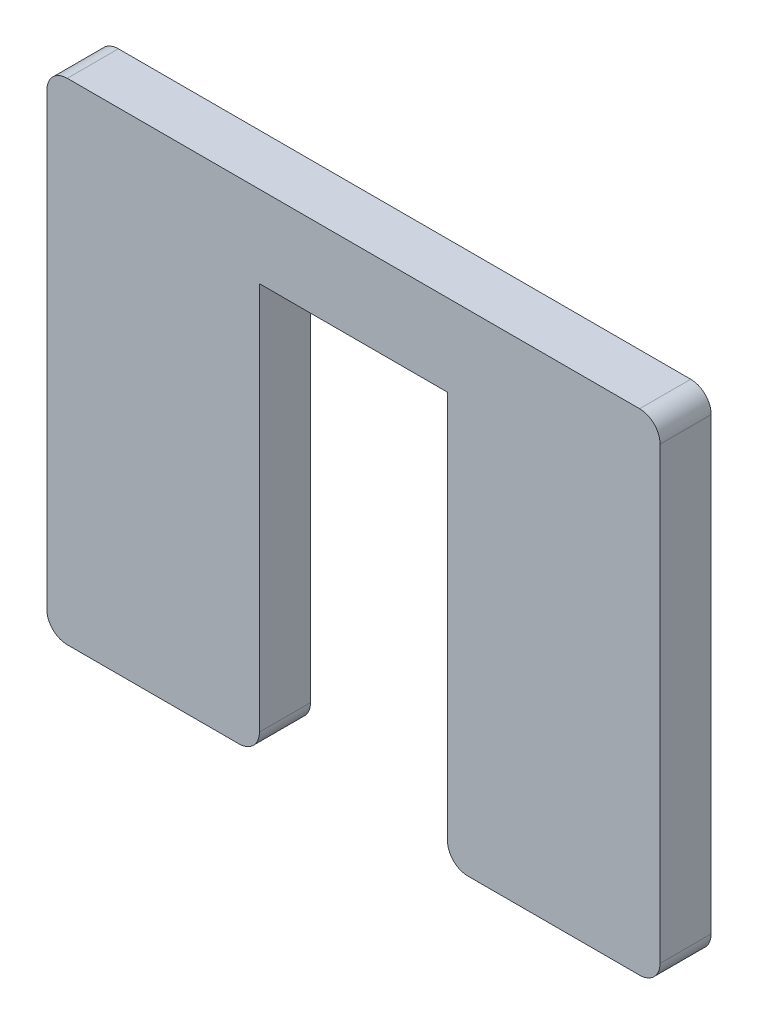
ISO-10303-21;
HEADER;
FILE_DESCRIPTION(('STEP AP214'),'2;1');
FILE_NAME('part.step','',(''),(''),'','','');
FILE_SCHEMA(('AUTOMOTIVE_DESIGN { 1 0 10303 214 1 1 1 1 }'));
ENDSEC;
DATA;
#1=APPLICATION_CONTEXT('core data for automotive mechanical design processes');
#2=APPLICATION_PROTOCOL_DEFINITION('international standard','automotive_design',2000,#1);
#3=PRODUCT_CONTEXT('',#1,'mechanical');
#4=PRODUCT('Part','Part','',(#3));
#5=PRODUCT_RELATED_PRODUCT_CATEGORY('part','',(#4));
#6=PRODUCT_DEFINITION_FORMATION('','',#4);
#7=PRODUCT_DEFINITION_CONTEXT('part definition',#1,'design');
#8=PRODUCT_DEFINITION('design','',#6,#7);
#9=PRODUCT_DEFINITION_SHAPE('','',#8);
#10=(LENGTH_UNIT() NAMED_UNIT(*) SI_UNIT(.MILLI.,.METRE.));
#11=(NAMED_UNIT(*) PLANE_ANGLE_UNIT() SI_UNIT($,.RADIAN.));
#12=(NAMED_UNIT(*) SI_UNIT($,.STERADIAN.) SOLID_ANGLE_UNIT());
#13=UNCERTAINTY_MEASURE_WITH_UNIT(LENGTH_MEASURE(1.E-05),#10,'distance_accuracy_value','');
#14=(GEOMETRIC_REPRESENTATION_CONTEXT(3) GLOBAL_UNCERTAINTY_ASSIGNED_CONTEXT((#13)) GLOBAL_UNIT_ASSIGNED_CONTEXT((#10,
#11,#12)) REPRESENTATION_CONTEXT('',''));
#15=CARTESIAN_POINT('',(0.,0.,0.));
#16=DIRECTION('',(0.,0.,1.));
#17=DIRECTION('',(1.,0.,0.));
#18=AXIS2_PLACEMENT_3D('',#15,#16,#17);
#19=CARTESIAN_POINT('',(9.2,-24.,5.));
#20=DIRECTION('',(0.,1.,0.));
#21=DIRECTION('',(-1.,0.,0.));
#22=AXIS2_PLACEMENT_3D('',#19,#20,#21);
#23=PLANE('',#22);
#24=DIRECTION('',(1.,0.,0.));
#25=VECTOR('',#24,1.);
#26=CARTESIAN_POINT('',(9.2,-24.,0.));
#27=LINE('',#26,#25);
#28=CARTESIAN_POINT('',(11.2,-24.,0.));
#29=VERTEX_POINT('',#28);
#30=CARTESIAN_POINT('',(28.,-24.,0.));
#31=VERTEX_POINT('',#30);
#32=EDGE_CURVE('E177',#29,#31,#27,.T.);
#33=ORIENTED_EDGE('',*,*,#32,.T.);
#34=DIRECTION('',(0.,0.,-1.));
#35=VECTOR('',#34,1.);
#36=CARTESIAN_POINT('',(28.,-24.,5.));
#37=LINE('',#36,#35);
#38=CARTESIAN_POINT('',(28.,-24.,5.));
#39=VERTEX_POINT('',#38);
#40=EDGE_CURVE('E236',#31,#39,#37,.F.);
#41=ORIENTED_EDGE('',*,*,#40,.T.);
#42=DIRECTION('',(1.,0.,0.));
#43=VECTOR('',#42,1.);
#44=CARTESIAN_POINT('',(9.2,-24.,5.));
#45=LINE('',#44,#43);
#46=CARTESIAN_POINT('',(11.2,-24.,5.));
#47=VERTEX_POINT('',#46);
#48=EDGE_CURVE('E205',#47,#39,#45,.T.);
#49=ORIENTED_EDGE('',*,*,#48,.F.);
#50=DIRECTION('',(0.,0.,-1.));
#51=VECTOR('',#50,1.);
#52=CARTESIAN_POINT('',(11.2,-24.,5.));
#53=LINE('',#52,#51);
#54=EDGE_CURVE('E232',#47,#29,#53,.T.);
#55=ORIENTED_EDGE('',*,*,#54,.T.);
#56=EDGE_LOOP('',(#33,#41,#49,#55));
#57=FACE_BOUND('',#56,.T.);
#58=ADVANCED_FACE('F43',(#57),#23,.F.);
#59=CARTESIAN_POINT('',(30.,24.,5.));
#60=DIRECTION('',(-1.,0.,0.));
#61=DIRECTION('',(0.,-1.,0.));
#62=AXIS2_PLACEMENT_3D('',#59,#60,#61);
#63=PLANE('',#62);
#64=DIRECTION('',(0.,1.,0.));
#65=VECTOR('',#64,1.);
#66=CARTESIAN_POINT('',(30.,24.,5.));
#67=LINE('',#66,#65);
#68=CARTESIAN_POINT('',(30.,-22.,5.));
#69=VERTEX_POINT('',#68);
#70=CARTESIAN_POINT('',(30.,22.,5.));
#71=VERTEX_POINT('',#70);
#72=EDGE_CURVE('E305',#69,#71,#67,.T.);
#73=ORIENTED_EDGE('',*,*,#72,.F.);
#74=DIRECTION('',(0.,0.,-1.));
#75=VECTOR('',#74,1.);
#76=CARTESIAN_POINT('',(30.,-22.,5.));
#77=LINE('',#76,#75);
#78=CARTESIAN_POINT('',(30.,-22.,0.));
#79=VERTEX_POINT('',#78);
#80=EDGE_CURVE('E210',#69,#79,#77,.T.);
#81=ORIENTED_EDGE('',*,*,#80,.T.);
#82=DIRECTION('',(0.,1.,0.));
#83=VECTOR('',#82,1.);
#84=CARTESIAN_POINT('',(30.,24.,0.));
#85=LINE('',#84,#83);
#86=CARTESIAN_POINT('',(30.,22.,0.));
#87=VERTEX_POINT('',#86);
#88=EDGE_CURVE('E181',#79,#87,#85,.T.);
#89=ORIENTED_EDGE('',*,*,#88,.T.);
#90=DIRECTION('',(0.,0.,-1.));
#91=VECTOR('',#90,1.);
#92=CARTESIAN_POINT('',(30.,22.,5.));
#93=LINE('',#92,#91);
#94=EDGE_CURVE('E165',#87,#71,#93,.F.);
#95=ORIENTED_EDGE('',*,*,#94,.T.);
#96=EDGE_LOOP('',(#73,#81,#89,#95));
#97=FACE_BOUND('',#96,.T.);
#98=ADVANCED_FACE('F323',(#97),#63,.F.);
#99=CARTESIAN_POINT('',(-30.,24.,5.));
#100=DIRECTION('',(0.,-1.,0.));
#101=DIRECTION('',(1.,0.,0.));
#102=AXIS2_PLACEMENT_3D('',#99,#100,#101);
#103=PLANE('',#102);
#104=DIRECTION('',(-1.,0.,0.));
#105=VECTOR('',#104,1.);
#106=CARTESIAN_POINT('',(-30.,24.,0.));
#107=LINE('',#106,#105);
#108=CARTESIAN_POINT('',(28.,24.,0.));
#109=VERTEX_POINT('',#108);
#110=CARTESIAN_POINT('',(-28.,24.,0.));
#111=VERTEX_POINT('',#110);
#112=EDGE_CURVE('E185',#109,#111,#107,.T.);
#113=ORIENTED_EDGE('',*,*,#112,.T.);
#114=DIRECTION('',(0.,0.,-1.));
#115=VECTOR('',#114,1.);
#116=CARTESIAN_POINT('',(-28.,24.,5.));
#117=LINE('',#116,#115);
#118=CARTESIAN_POINT('',(-28.,24.,5.));
#119=VERTEX_POINT('',#118);
#120=EDGE_CURVE('E11',#111,#119,#117,.F.);
#121=ORIENTED_EDGE('',*,*,#120,.T.);
#122=DIRECTION('',(-1.,0.,0.));
#123=VECTOR('',#122,1.);
#124=CARTESIAN_POINT('',(-30.,24.,5.));
#125=LINE('',#124,#123);
#126=CARTESIAN_POINT('',(28.,24.,5.));
#127=VERTEX_POINT('',#126);
#128=EDGE_CURVE('E283',#127,#119,#125,.T.);
#129=ORIENTED_EDGE('',*,*,#128,.F.);
#130=DIRECTION('',(0.,0.,-1.));
#131=VECTOR('',#130,1.);
#132=CARTESIAN_POINT('',(28.,24.,5.));
#133=LINE('',#132,#131);
#134=EDGE_CURVE('E52',#127,#109,#133,.T.);
#135=ORIENTED_EDGE('',*,*,#134,.T.);
#136=EDGE_LOOP('',(#113,#121,#129,#135));
#137=FACE_BOUND('',#136,.T.);
#138=ADVANCED_FACE('F280',(#137),#103,.F.);
#139=CARTESIAN_POINT('',(-30.,24.,5.));
#140=DIRECTION('',(1.,0.,0.));
#141=DIRECTION('',(0.,1.,0.));
#142=AXIS2_PLACEMENT_3D('',#139,#140,#141);
#143=PLANE('',#142);
#144=DIRECTION('',(0.,-1.,0.));
#145=VECTOR('',#144,1.);
#146=CARTESIAN_POINT('',(-30.,24.,0.));
#147=LINE('',#146,#145);
#148=CARTESIAN_POINT('',(-30.,22.,0.));
#149=VERTEX_POINT('',#148);
#150=CARTESIAN_POINT('',(-30.,-22.,0.));
#151=VERTEX_POINT('',#150);
#152=EDGE_CURVE('E189',#149,#151,#147,.T.);
#153=ORIENTED_EDGE('',*,*,#152,.T.);
#154=DIRECTION('',(0.,0.,-1.));
#155=VECTOR('',#154,1.);
#156=CARTESIAN_POINT('',(-30.,-22.,5.));
#157=LINE('',#156,#155);
#158=CARTESIAN_POINT('',(-30.,-22.,5.));
#159=VERTEX_POINT('',#158);
#160=EDGE_CURVE('E272',#151,#159,#157,.F.);
#161=ORIENTED_EDGE('',*,*,#160,.T.);
#162=DIRECTION('',(0.,-1.,0.));
#163=VECTOR('',#162,1.);
#164=CARTESIAN_POINT('',(-30.,24.,5.));
#165=LINE('',#164,#163);
#166=CARTESIAN_POINT('',(-30.,22.,5.));
#167=VERTEX_POINT('',#166);
#168=EDGE_CURVE('E299',#167,#159,#165,.T.);
#169=ORIENTED_EDGE('',*,*,#168,.F.);
#170=DIRECTION('',(0.,0.,-1.));
#171=VECTOR('',#170,1.);
#172=CARTESIAN_POINT('',(-30.,22.,5.));
#173=LINE('',#172,#171);
#174=EDGE_CURVE('E268',#167,#149,#173,.T.);
#175=ORIENTED_EDGE('',*,*,#174,.T.);
#176=EDGE_LOOP('',(#153,#161,#169,#175));
#177=FACE_BOUND('',#176,.T.);
#178=ADVANCED_FACE('F296',(#177),#143,.F.);
#179=CARTESIAN_POINT('',(-30.,-24.,5.));
#180=DIRECTION('',(0.,1.,0.));
#181=DIRECTION('',(0.,0.,1.));
#182=AXIS2_PLACEMENT_3D('',#179,#180,#181);
#183=PLANE('',#182);
#184=DIRECTION('',(1.,0.,0.));
#185=VECTOR('',#184,1.);
#186=CARTESIAN_POINT('',(-30.,-24.,0.));
#187=LINE('',#186,#185);
#188=CARTESIAN_POINT('',(-28.,-24.,0.));
#189=VERTEX_POINT('',#188);
#190=CARTESIAN_POINT('',(-11.2,-24.,0.));
#191=VERTEX_POINT('',#190);
#192=EDGE_CURVE('E193',#189,#191,#187,.T.);
#193=ORIENTED_EDGE('',*,*,#192,.T.);
#194=DIRECTION('',(0.,0.,-1.));
#195=VECTOR('',#194,1.);
#196=CARTESIAN_POINT('',(-11.2,-24.,5.));
#197=LINE('',#196,#195);
#198=CARTESIAN_POINT('',(-11.2,-24.,5.));
#199=VERTEX_POINT('',#198);
#200=EDGE_CURVE('E265',#191,#199,#197,.F.);
#201=ORIENTED_EDGE('',*,*,#200,.T.);
#202=DIRECTION('',(1.,0.,0.));
#203=VECTOR('',#202,1.);
#204=CARTESIAN_POINT('',(-30.,-24.,5.));
#205=LINE('',#204,#203);
#206=CARTESIAN_POINT('',(-28.,-24.,5.));
#207=VERTEX_POINT('',#206);
#208=EDGE_CURVE('E155',#207,#199,#205,.T.);
#209=ORIENTED_EDGE('',*,*,#208,.F.);
#210=DIRECTION('',(0.,0.,-1.));
#211=VECTOR('',#210,1.);
#212=CARTESIAN_POINT('',(-28.,-24.,5.));
#213=LINE('',#212,#211);
#214=EDGE_CURVE('E261',#207,#189,#213,.T.);
#215=ORIENTED_EDGE('',*,*,#214,.T.);
#216=EDGE_LOOP('',(#193,#201,#209,#215));
#217=FACE_BOUND('',#216,.T.);
#218=ADVANCED_FACE('F419',(#217),#183,.F.);
#219=CARTESIAN_POINT('',(-9.19999999999999,-24.,5.));
#220=DIRECTION('',(-1.,0.,0.));
#221=DIRECTION('',(0.,0.,1.));
#222=AXIS2_PLACEMENT_3D('',#219,#220,#221);
#223=PLANE('',#222);
#224=DIRECTION('',(0.,1.,0.));
#225=VECTOR('',#224,1.);
#226=CARTESIAN_POINT('',(-9.19999999999999,-24.,5.));
#227=LINE('',#226,#225);
#228=CARTESIAN_POINT('',(-9.19999999999999,-22.,5.));
#229=VERTEX_POINT('',#228);
#230=CARTESIAN_POINT('',(-9.19999999999999,16.,5.));
#231=VERTEX_POINT('',#230);
#232=EDGE_CURVE('E144',#229,#231,#227,.T.);
#233=ORIENTED_EDGE('',*,*,#232,.F.);
#234=DIRECTION('',(0.,0.,-1.));
#235=VECTOR('',#234,1.);
#236=CARTESIAN_POINT('',(-9.19999999999999,-22.,5.));
#237=LINE('',#236,#235);
#238=CARTESIAN_POINT('',(-9.19999999999999,-22.,0.));
#239=VERTEX_POINT('',#238);
#240=EDGE_CURVE('E258',#229,#239,#237,.T.);
#241=ORIENTED_EDGE('',*,*,#240,.T.);
#242=DIRECTION('',(0.,1.,0.));
#243=VECTOR('',#242,1.);
#244=CARTESIAN_POINT('',(-9.19999999999999,-24.,0.));
#245=LINE('',#244,#243);
#246=CARTESIAN_POINT('',(-9.19999999999999,16.,0.));
#247=VERTEX_POINT('',#246);
#248=EDGE_CURVE('E161',#239,#247,#245,.T.);
#249=ORIENTED_EDGE('',*,*,#248,.T.);
#250=DIRECTION('',(0.,0.,-1.));
#251=VECTOR('',#250,1.);
#252=CARTESIAN_POINT('',(-9.19999999999999,16.,5.));
#253=LINE('',#252,#251);
#254=EDGE_CURVE('E158',#231,#247,#253,.T.);
#255=ORIENTED_EDGE('',*,*,#254,.F.);
#256=EDGE_LOOP('',(#233,#241,#249,#255));
#257=FACE_BOUND('',#256,.T.);
#258=ADVANCED_FACE('F159',(#257),#223,.F.);
#259=CARTESIAN_POINT('',(-9.19999999999999,16.,5.));
#260=DIRECTION('',(0.,1.,0.));
#261=DIRECTION('',(0.,0.,1.));
#262=AXIS2_PLACEMENT_3D('',#259,#260,#261);
#263=PLANE('',#262);
#264=DIRECTION('',(1.,0.,0.));
#265=VECTOR('',#264,1.);
#266=CARTESIAN_POINT('',(-9.19999999999999,16.,0.));
#267=LINE('',#266,#265);
#268=CARTESIAN_POINT('',(9.2,16.,0.));
#269=VERTEX_POINT('',#268);
#270=EDGE_CURVE('E199',#247,#269,#267,.T.);
#271=ORIENTED_EDGE('',*,*,#270,.T.);
#272=DIRECTION('',(0.,0.,-1.));
#273=VECTOR('',#272,1.);
#274=CARTESIAN_POINT('',(9.2,16.,5.));
#275=LINE('',#274,#273);
#276=CARTESIAN_POINT('',(9.2,16.,5.));
#277=VERTEX_POINT('',#276);
#278=EDGE_CURVE('E166',#277,#269,#275,.T.);
#279=ORIENTED_EDGE('',*,*,#278,.F.);
#280=DIRECTION('',(1.,0.,0.));
#281=VECTOR('',#280,1.);
#282=CARTESIAN_POINT('',(-9.19999999999999,16.,5.));
#283=LINE('',#282,#281);
#284=EDGE_CURVE('E149',#231,#277,#283,.T.);
#285=ORIENTED_EDGE('',*,*,#284,.F.);
#286=ORIENTED_EDGE('',*,*,#254,.T.);
#287=EDGE_LOOP('',(#271,#279,#285,#286));
#288=FACE_BOUND('',#287,.T.);
#289=ADVANCED_FACE('F168',(#288),#263,.F.);
#290=CARTESIAN_POINT('',(9.2,-24.,5.));
#291=DIRECTION('',(1.,0.,0.));
#292=DIRECTION('',(0.,0.,-1.));
#293=AXIS2_PLACEMENT_3D('',#290,#291,#292);
#294=PLANE('',#293);
#295=DIRECTION('',(0.,-1.,0.));
#296=VECTOR('',#295,1.);
#297=CARTESIAN_POINT('',(9.2,-24.,0.));
#298=LINE('',#297,#296);
#299=CARTESIAN_POINT('',(9.2,-22.,0.));
#300=VERTEX_POINT('',#299);
#301=EDGE_CURVE('E202',#269,#300,#298,.T.);
#302=ORIENTED_EDGE('',*,*,#301,.T.);
#303=DIRECTION('',(0.,0.,-1.));
#304=VECTOR('',#303,1.);
#305=CARTESIAN_POINT('',(9.2,-22.,5.));
#306=LINE('',#305,#304);
#307=CARTESIAN_POINT('',(9.2,-22.,5.));
#308=VERTEX_POINT('',#307);
#309=EDGE_CURVE('E59',#300,#308,#306,.F.);
#310=ORIENTED_EDGE('',*,*,#309,.T.);
#311=DIRECTION('',(0.,-1.,0.));
#312=VECTOR('',#311,1.);
#313=CARTESIAN_POINT('',(9.2,-24.,5.));
#314=LINE('',#313,#312);
#315=EDGE_CURVE('E171',#277,#308,#314,.T.);
#316=ORIENTED_EDGE('',*,*,#315,.F.);
#317=ORIENTED_EDGE('',*,*,#278,.T.);
#318=EDGE_LOOP('',(#302,#310,#316,#317));
#319=FACE_BOUND('',#318,.T.);
#320=ADVANCED_FACE('F329',(#319),#294,.F.);
#321=CARTESIAN_POINT('',(0.,0.,5.));
#322=DIRECTION('',(0.,0.,-1.));
#323=DIRECTION('',(-1.,0.,0.));
#324=AXIS2_PLACEMENT_3D('',#321,#322,#323);
#325=PLANE('',#324);
#326=ORIENTED_EDGE('',*,*,#48,.T.);
#327=CARTESIAN_POINT('',(28.,-22.,5.));
#328=DIRECTION('',(0.,0.,-1.));
#329=DIRECTION('',(-1.,0.,0.));
#330=AXIS2_PLACEMENT_3D('',#327,#328,#329);
#331=CIRCLE('',#330,2.);
#332=EDGE_CURVE('E253',#39,#69,#331,.F.);
#333=ORIENTED_EDGE('',*,*,#332,.T.);
#334=ORIENTED_EDGE('',*,*,#72,.T.);
#335=CARTESIAN_POINT('',(28.,22.,5.));
#336=DIRECTION('',(0.,0.,-1.));
#337=DIRECTION('',(-1.,0.,0.));
#338=AXIS2_PLACEMENT_3D('',#335,#336,#337);
#339=CIRCLE('',#338,2.);
#340=EDGE_CURVE('E239',#71,#127,#339,.F.);
#341=ORIENTED_EDGE('',*,*,#340,.T.);
#342=ORIENTED_EDGE('',*,*,#128,.T.);
#343=CARTESIAN_POINT('',(-28.,22.,5.));
#344=DIRECTION('',(0.,0.,-1.));
#345=DIRECTION('',(-1.,0.,0.));
#346=AXIS2_PLACEMENT_3D('',#343,#344,#345);
#347=CIRCLE('',#346,2.);
#348=EDGE_CURVE('E242',#119,#167,#347,.F.);
#349=ORIENTED_EDGE('',*,*,#348,.T.);
#350=ORIENTED_EDGE('',*,*,#168,.T.);
#351=CARTESIAN_POINT('',(-28.,-22.,5.));
#352=DIRECTION('',(0.,0.,-1.));
#353=DIRECTION('',(-1.,0.,0.));
#354=AXIS2_PLACEMENT_3D('',#351,#352,#353);
#355=CIRCLE('',#354,2.);
#356=EDGE_CURVE('E245',#159,#207,#355,.F.);
#357=ORIENTED_EDGE('',*,*,#356,.T.);
#358=ORIENTED_EDGE('',*,*,#208,.T.);
#359=CARTESIAN_POINT('',(-11.2,-22.,5.));
#360=DIRECTION('',(0.,0.,-1.));
#361=DIRECTION('',(-1.,0.,0.));
#362=AXIS2_PLACEMENT_3D('',#359,#360,#361);
#363=CIRCLE('',#362,2.);
#364=EDGE_CURVE('E67',#199,#229,#363,.F.);
#365=ORIENTED_EDGE('',*,*,#364,.T.);
#366=ORIENTED_EDGE('',*,*,#232,.T.);
#367=ORIENTED_EDGE('',*,*,#284,.T.);
#368=ORIENTED_EDGE('',*,*,#315,.T.);
#369=CARTESIAN_POINT('',(11.2,-22.,5.));
#370=DIRECTION('',(0.,0.,-1.));
#371=DIRECTION('',(-1.,0.,0.));
#372=AXIS2_PLACEMENT_3D('',#369,#370,#371);
#373=CIRCLE('',#372,2.);
#374=EDGE_CURVE('E250',#308,#47,#373,.F.);
#375=ORIENTED_EDGE('',*,*,#374,.T.);
#376=EDGE_LOOP('',(#326,#333,#334,#341,#342,#349,#350,#357,#358,#365,#366,#367,#368,#375));
#377=FACE_BOUND('',#376,.T.);
#378=ADVANCED_FACE('F147',(#377),#325,.F.);
#379=CARTESIAN_POINT('',(0.,0.,0.));
#380=DIRECTION('',(0.,0.,-1.));
#381=DIRECTION('',(-1.,0.,0.));
#382=AXIS2_PLACEMENT_3D('',#379,#380,#381);
#383=PLANE('',#382);
#384=ORIENTED_EDGE('',*,*,#88,.F.);
#385=CARTESIAN_POINT('',(28.,-22.,0.));
#386=DIRECTION('',(0.,0.,-1.));
#387=DIRECTION('',(-1.,0.,0.));
#388=AXIS2_PLACEMENT_3D('',#385,#386,#387);
#389=CIRCLE('',#388,2.);
#390=EDGE_CURVE('E229',#79,#31,#389,.T.);
#391=ORIENTED_EDGE('',*,*,#390,.T.);
#392=ORIENTED_EDGE('',*,*,#32,.F.);
#393=CARTESIAN_POINT('',(11.2,-22.,0.));
#394=DIRECTION('',(0.,0.,-1.));
#395=DIRECTION('',(-1.,0.,0.));
#396=AXIS2_PLACEMENT_3D('',#393,#394,#395);
#397=CIRCLE('',#396,2.);
#398=EDGE_CURVE('E226',#29,#300,#397,.T.);
#399=ORIENTED_EDGE('',*,*,#398,.T.);
#400=ORIENTED_EDGE('',*,*,#301,.F.);
#401=ORIENTED_EDGE('',*,*,#270,.F.);
#402=ORIENTED_EDGE('',*,*,#248,.F.);
#403=CARTESIAN_POINT('',(-11.2,-22.,0.));
#404=DIRECTION('',(0.,0.,-1.));
#405=DIRECTION('',(-1.,0.,0.));
#406=AXIS2_PLACEMENT_3D('',#403,#404,#405);
#407=CIRCLE('',#406,2.);
#408=EDGE_CURVE('E223',#239,#191,#407,.T.);
#409=ORIENTED_EDGE('',*,*,#408,.T.);
#410=ORIENTED_EDGE('',*,*,#192,.F.);
#411=CARTESIAN_POINT('',(-28.,-22.,0.));
#412=DIRECTION('',(0.,0.,-1.));
#413=DIRECTION('',(-1.,0.,0.));
#414=AXIS2_PLACEMENT_3D('',#411,#412,#413);
#415=CIRCLE('',#414,2.);
#416=EDGE_CURVE('E220',#189,#151,#415,.T.);
#417=ORIENTED_EDGE('',*,*,#416,.T.);
#418=ORIENTED_EDGE('',*,*,#152,.F.);
#419=CARTESIAN_POINT('',(-28.,22.,0.));
#420=DIRECTION('',(0.,0.,-1.));
#421=DIRECTION('',(-1.,0.,0.));
#422=AXIS2_PLACEMENT_3D('',#419,#420,#421);
#423=CIRCLE('',#422,2.);
#424=EDGE_CURVE('E217',#149,#111,#423,.T.);
#425=ORIENTED_EDGE('',*,*,#424,.T.);
#426=ORIENTED_EDGE('',*,*,#112,.F.);
#427=CARTESIAN_POINT('',(28.,22.,0.));
#428=DIRECTION('',(0.,0.,-1.));
#429=DIRECTION('',(-1.,0.,0.));
#430=AXIS2_PLACEMENT_3D('',#427,#428,#429);
#431=CIRCLE('',#430,2.);
#432=EDGE_CURVE('E214',#109,#87,#431,.T.);
#433=ORIENTED_EDGE('',*,*,#432,.T.);
#434=EDGE_LOOP('',(#384,#391,#392,#399,#400,#401,#402,#409,#410,#417,#418,#425,#426,#433));
#435=FACE_BOUND('',#434,.T.);
#436=ADVANCED_FACE('F288',(#435),#383,.T.);
#437=CARTESIAN_POINT('',(28.,-22.,5.));
#438=DIRECTION('',(0.,0.,-1.));
#439=DIRECTION('',(-1.,0.,0.));
#440=AXIS2_PLACEMENT_3D('',#437,#438,#439);
#441=CYLINDRICAL_SURFACE('',#440,2.);
#442=ORIENTED_EDGE('',*,*,#332,.F.);
#443=ORIENTED_EDGE('',*,*,#40,.F.);
#444=ORIENTED_EDGE('',*,*,#390,.F.);
#445=ORIENTED_EDGE('',*,*,#80,.F.);
#446=EDGE_LOOP('',(#442,#443,#444,#445));
#447=FACE_BOUND('',#446,.T.);
#448=ADVANCED_FACE('F321',(#447),#441,.T.);
#449=CARTESIAN_POINT('',(11.2,-22.,5.));
#450=DIRECTION('',(0.,0.,-1.));
#451=DIRECTION('',(-1.,0.,0.));
#452=AXIS2_PLACEMENT_3D('',#449,#450,#451);
#453=CYLINDRICAL_SURFACE('',#452,2.);
#454=ORIENTED_EDGE('',*,*,#374,.F.);
#455=ORIENTED_EDGE('',*,*,#309,.F.);
#456=ORIENTED_EDGE('',*,*,#398,.F.);
#457=ORIENTED_EDGE('',*,*,#54,.F.);
#458=EDGE_LOOP('',(#454,#455,#456,#457));
#459=FACE_BOUND('',#458,.T.);
#460=ADVANCED_FACE('F327',(#459),#453,.T.);
#461=CARTESIAN_POINT('',(-11.2,-22.,5.));
#462=DIRECTION('',(0.,0.,-1.));
#463=DIRECTION('',(-1.,0.,0.));
#464=AXIS2_PLACEMENT_3D('',#461,#462,#463);
#465=CYLINDRICAL_SURFACE('',#464,2.);
#466=ORIENTED_EDGE('',*,*,#364,.F.);
#467=ORIENTED_EDGE('',*,*,#200,.F.);
#468=ORIENTED_EDGE('',*,*,#408,.F.);
#469=ORIENTED_EDGE('',*,*,#240,.F.);
#470=EDGE_LOOP('',(#466,#467,#468,#469));
#471=FACE_BOUND('',#470,.T.);
#472=ADVANCED_FACE('F351',(#471),#465,.T.);
#473=CARTESIAN_POINT('',(-28.,-22.,5.));
#474=DIRECTION('',(0.,0.,-1.));
#475=DIRECTION('',(-1.,0.,0.));
#476=AXIS2_PLACEMENT_3D('',#473,#474,#475);
#477=CYLINDRICAL_SURFACE('',#476,2.);
#478=ORIENTED_EDGE('',*,*,#356,.F.);
#479=ORIENTED_EDGE('',*,*,#160,.F.);
#480=ORIENTED_EDGE('',*,*,#416,.F.);
#481=ORIENTED_EDGE('',*,*,#214,.F.);
#482=EDGE_LOOP('',(#478,#479,#480,#481));
#483=FACE_BOUND('',#482,.T.);
#484=ADVANCED_FACE('F354',(#483),#477,.T.);
#485=CARTESIAN_POINT('',(-28.,22.,5.));
#486=DIRECTION('',(0.,0.,-1.));
#487=DIRECTION('',(-1.,0.,0.));
#488=AXIS2_PLACEMENT_3D('',#485,#486,#487);
#489=CYLINDRICAL_SURFACE('',#488,2.);
#490=ORIENTED_EDGE('',*,*,#348,.F.);
#491=ORIENTED_EDGE('',*,*,#120,.F.);
#492=ORIENTED_EDGE('',*,*,#424,.F.);
#493=ORIENTED_EDGE('',*,*,#174,.F.);
#494=EDGE_LOOP('',(#490,#491,#492,#493));
#495=FACE_BOUND('',#494,.T.);
#496=ADVANCED_FACE('F293',(#495),#489,.T.);
#497=CARTESIAN_POINT('',(28.,22.,5.));
#498=DIRECTION('',(0.,0.,-1.));
#499=DIRECTION('',(-1.,0.,0.));
#500=AXIS2_PLACEMENT_3D('',#497,#498,#499);
#501=CYLINDRICAL_SURFACE('',#500,2.);
#502=ORIENTED_EDGE('',*,*,#340,.F.);
#503=ORIENTED_EDGE('',*,*,#94,.F.);
#504=ORIENTED_EDGE('',*,*,#432,.F.);
#505=ORIENTED_EDGE('',*,*,#134,.F.);
#506=EDGE_LOOP('',(#502,#503,#504,#505));
#507=FACE_BOUND('',#506,.T.);
#508=ADVANCED_FACE('F45',(#507),#501,.T.);
#509=CLOSED_SHELL('',(#58,#98,#138,#178,#218,#258,#289,#320,#378,#436,#448,#460,#472,#484,#496,#508));
#510=MANIFOLD_SOLID_BREP('B2',#509);
#511=ADVANCED_BREP_SHAPE_REPRESENTATION('',(#18,#510),#14);
#512=SHAPE_DEFINITION_REPRESENTATION(#9,#511);
ENDSEC;
END-ISO-10303-21;
